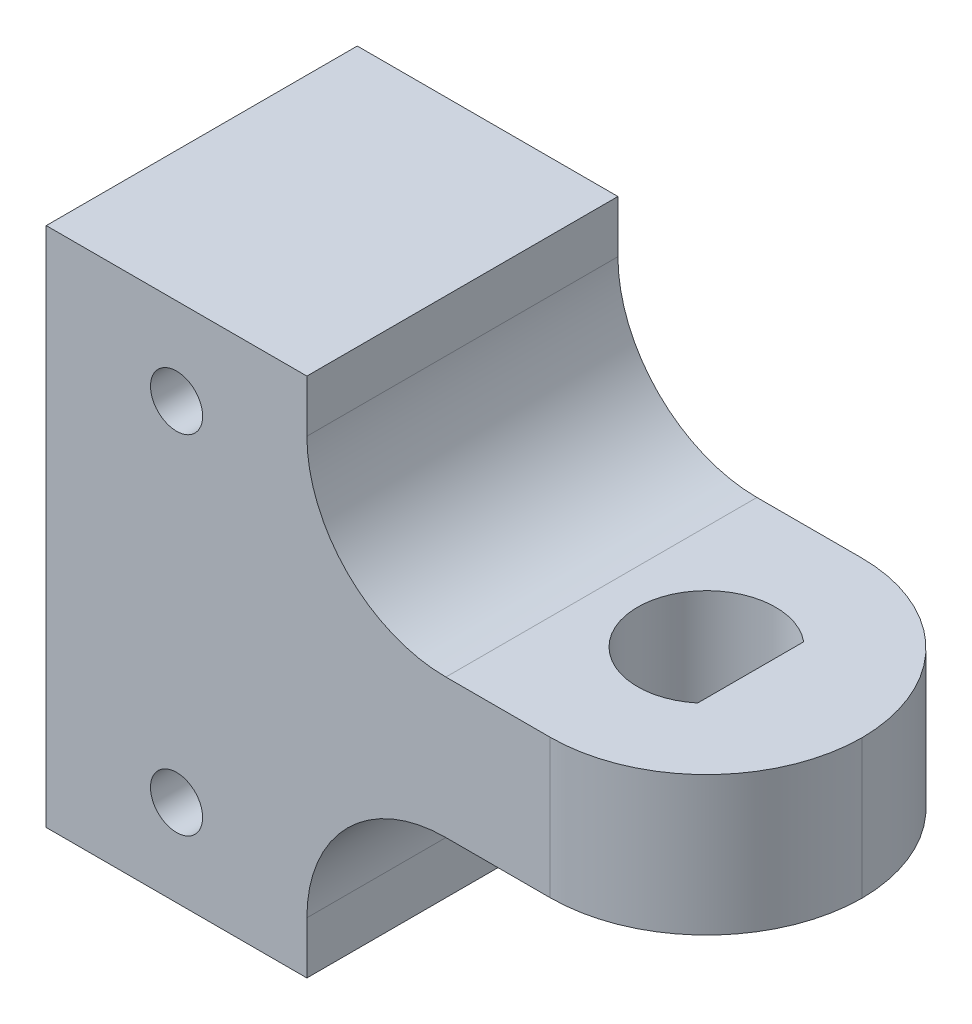
ISO-10303-21;
HEADER;
FILE_DESCRIPTION(('STEP AP214'),'2;1');
FILE_NAME('part.step','',(''),(''),'','','');
FILE_SCHEMA(('AUTOMOTIVE_DESIGN { 1 0 10303 214 1 1 1 1 }'));
ENDSEC;
DATA;
#1=APPLICATION_CONTEXT('core data for automotive mechanical design processes');
#2=APPLICATION_PROTOCOL_DEFINITION('international standard','automotive_design',2000,#1);
#3=PRODUCT_CONTEXT('',#1,'mechanical');
#4=PRODUCT('Part','Part','',(#3));
#5=PRODUCT_RELATED_PRODUCT_CATEGORY('part','',(#4));
#6=PRODUCT_DEFINITION_FORMATION('','',#4);
#7=PRODUCT_DEFINITION_CONTEXT('part definition',#1,'design');
#8=PRODUCT_DEFINITION('design','',#6,#7);
#9=PRODUCT_DEFINITION_SHAPE('','',#8);
#10=(LENGTH_UNIT() NAMED_UNIT(*) SI_UNIT(.MILLI.,.METRE.));
#11=(NAMED_UNIT(*) PLANE_ANGLE_UNIT() SI_UNIT($,.RADIAN.));
#12=(NAMED_UNIT(*) SI_UNIT($,.STERADIAN.) SOLID_ANGLE_UNIT());
#13=UNCERTAINTY_MEASURE_WITH_UNIT(LENGTH_MEASURE(1.E-05),#10,'distance_accuracy_value','');
#14=(GEOMETRIC_REPRESENTATION_CONTEXT(3) GLOBAL_UNCERTAINTY_ASSIGNED_CONTEXT((#13)) GLOBAL_UNIT_ASSIGNED_CONTEXT((#10,
#11,#12)) REPRESENTATION_CONTEXT('',''));
#15=CARTESIAN_POINT('',(0.,0.,0.));
#16=DIRECTION('',(0.,0.,1.));
#17=DIRECTION('',(1.,0.,0.));
#18=AXIS2_PLACEMENT_3D('',#15,#16,#17);
#19=CARTESIAN_POINT('',(7.5,-4.,17.9));
#20=DIRECTION('',(-1.,0.,0.));
#21=DIRECTION('',(0.,-1.,0.));
#22=AXIS2_PLACEMENT_3D('',#19,#20,#21);
#23=PLANE('',#22);
#24=DIRECTION('',(0.,1.,0.));
#25=VECTOR('',#24,1.);
#26=CARTESIAN_POINT('',(7.5,-4.,0.));
#27=LINE('',#26,#25);
#28=CARTESIAN_POINT('',(7.5,-15.,0.));
#29=VERTEX_POINT('',#28);
#30=CARTESIAN_POINT('',(7.5,-12.,0.));
#31=VERTEX_POINT('',#30);
#32=EDGE_CURVE('E178',#29,#31,#27,.T.);
#33=ORIENTED_EDGE('',*,*,#32,.T.);
#34=DIRECTION('',(0.,0.,-1.));
#35=VECTOR('',#34,1.);
#36=CARTESIAN_POINT('',(7.5,-12.,17.9));
#37=LINE('',#36,#35);
#38=CARTESIAN_POINT('',(7.5,-12.,17.9));
#39=VERTEX_POINT('',#38);
#40=EDGE_CURVE('E222',#31,#39,#37,.F.);
#41=ORIENTED_EDGE('',*,*,#40,.T.);
#42=DIRECTION('',(0.,1.,0.));
#43=VECTOR('',#42,1.);
#44=CARTESIAN_POINT('',(7.5,-4.,17.9));
#45=LINE('',#44,#43);
#46=CARTESIAN_POINT('',(7.5,-15.,17.9));
#47=VERTEX_POINT('',#46);
#48=EDGE_CURVE('E161',#47,#39,#45,.T.);
#49=ORIENTED_EDGE('',*,*,#48,.F.);
#50=DIRECTION('',(0.,0.,-1.));
#51=VECTOR('',#50,1.);
#52=CARTESIAN_POINT('',(7.5,-15.,17.9));
#53=LINE('',#52,#51);
#54=EDGE_CURVE('E177',#47,#29,#53,.T.);
#55=ORIENTED_EDGE('',*,*,#54,.T.);
#56=EDGE_LOOP('',(#33,#41,#49,#55));
#57=FACE_BOUND('',#56,.T.);
#58=ADVANCED_FACE('F33',(#57),#23,.F.);
#59=CARTESIAN_POINT('',(30.5,-4.,17.9));
#60=DIRECTION('',(0.,1.,0.));
#61=DIRECTION('',(0.,0.,1.));
#62=AXIS2_PLACEMENT_3D('',#59,#60,#61);
#63=PLANE('',#62);
#64=DIRECTION('',(0.,0.,1.));
#65=VECTOR('',#64,1.);
#66=CARTESIAN_POINT('',(24.04,-4.,5.8488854495447));
#67=LINE('',#66,#65);
#68=CARTESIAN_POINT('',(24.04,-4.,5.8488854495447));
#69=VERTEX_POINT('',#68);
#70=CARTESIAN_POINT('',(24.04,-4.,11.9511145504553));
#71=VERTEX_POINT('',#70);
#72=EDGE_CURVE('E142',#69,#71,#67,.T.);
#73=ORIENTED_EDGE('',*,*,#72,.F.);
#74=CARTESIAN_POINT('',(21.5,-4.,8.9));
#75=DIRECTION('',(0.,1.,0.));
#76=DIRECTION('',(0.,0.,1.));
#77=AXIS2_PLACEMENT_3D('',#74,#75,#76);
#78=CIRCLE('',#77,3.97);
#79=EDGE_CURVE('E131',#71,#69,#78,.F.);
#80=ORIENTED_EDGE('',*,*,#79,.F.);
#81=EDGE_LOOP('',(#73,#80));
#82=FACE_BOUND('',#81,.T.);
#83=DIRECTION('',(1.,0.,0.));
#84=VECTOR('',#83,1.);
#85=CARTESIAN_POINT('',(30.5,-4.,17.9));
#86=LINE('',#85,#84);
#87=CARTESIAN_POINT('',(15.5,-4.,17.9));
#88=VERTEX_POINT('',#87);
#89=CARTESIAN_POINT('',(21.5,-4.,17.9));
#90=VERTEX_POINT('',#89);
#91=EDGE_CURVE('E164',#88,#90,#86,.T.);
#92=ORIENTED_EDGE('',*,*,#91,.F.);
#93=DIRECTION('',(0.,0.,-1.));
#94=VECTOR('',#93,1.);
#95=CARTESIAN_POINT('',(15.5,-4.,0.));
#96=LINE('',#95,#94);
#97=CARTESIAN_POINT('',(15.5,-4.,0.));
#98=VERTEX_POINT('',#97);
#99=EDGE_CURVE('E217',#88,#98,#96,.T.);
#100=ORIENTED_EDGE('',*,*,#99,.T.);
#101=DIRECTION('',(1.,0.,0.));
#102=VECTOR('',#101,1.);
#103=CARTESIAN_POINT('',(30.5,-4.,0.));
#104=LINE('',#103,#102);
#105=CARTESIAN_POINT('',(21.5,-4.,0.));
#106=VERTEX_POINT('',#105);
#107=EDGE_CURVE('E181',#98,#106,#104,.T.);
#108=ORIENTED_EDGE('',*,*,#107,.T.);
#109=CARTESIAN_POINT('',(21.5,-4.,9.));
#110=DIRECTION('',(0.,1.,0.));
#111=DIRECTION('',(0.,0.,1.));
#112=AXIS2_PLACEMENT_3D('',#109,#110,#111);
#113=CIRCLE('',#112,9.);
#114=CARTESIAN_POINT('',(30.4998611100394,-4.,8.95));
#115=VERTEX_POINT('',#114);
#116=EDGE_CURVE('E213',#106,#115,#113,.F.);
#117=ORIENTED_EDGE('',*,*,#116,.T.);
#118=CARTESIAN_POINT('',(21.5,-4.,8.9));
#119=DIRECTION('',(0.,1.,0.));
#120=DIRECTION('',(0.,0.,1.));
#121=AXIS2_PLACEMENT_3D('',#118,#119,#120);
#122=CIRCLE('',#121,9.);
#123=EDGE_CURVE('E210',#115,#90,#122,.F.);
#124=ORIENTED_EDGE('',*,*,#123,.T.);
#125=EDGE_LOOP('',(#92,#100,#108,#117,#124));
#126=FACE_BOUND('',#125,.T.);
#127=ADVANCED_FACE('F147',(#82,#126),#63,.F.);
#128=CARTESIAN_POINT('',(7.5,4.,17.9));
#129=DIRECTION('',(0.,-1.,0.));
#130=DIRECTION('',(0.,0.,-1.));
#131=AXIS2_PLACEMENT_3D('',#128,#129,#130);
#132=PLANE('',#131);
#133=DIRECTION('',(0.,0.,-1.));
#134=VECTOR('',#133,1.);
#135=CARTESIAN_POINT('',(24.04,4.,5.8488854495447));
#136=LINE('',#135,#134);
#137=CARTESIAN_POINT('',(24.04,4.,11.9511145504553));
#138=VERTEX_POINT('',#137);
#139=CARTESIAN_POINT('',(24.04,4.,5.8488854495447));
#140=VERTEX_POINT('',#139);
#141=EDGE_CURVE('E139',#138,#140,#136,.T.);
#142=ORIENTED_EDGE('',*,*,#141,.F.);
#143=CARTESIAN_POINT('',(21.5,4.,8.9));
#144=DIRECTION('',(0.,1.,0.));
#145=DIRECTION('',(0.,0.,1.));
#146=AXIS2_PLACEMENT_3D('',#143,#144,#145);
#147=CIRCLE('',#146,3.97);
#148=EDGE_CURVE('E134',#140,#138,#147,.T.);
#149=ORIENTED_EDGE('',*,*,#148,.F.);
#150=EDGE_LOOP('',(#142,#149));
#151=FACE_BOUND('',#150,.T.);
#152=DIRECTION('',(-1.,0.,0.));
#153=VECTOR('',#152,1.);
#154=CARTESIAN_POINT('',(7.5,4.,0.));
#155=LINE('',#154,#153);
#156=CARTESIAN_POINT('',(21.5,4.,0.));
#157=VERTEX_POINT('',#156);
#158=CARTESIAN_POINT('',(15.5,4.,0.));
#159=VERTEX_POINT('',#158);
#160=EDGE_CURVE('E183',#157,#159,#155,.T.);
#161=ORIENTED_EDGE('',*,*,#160,.T.);
#162=DIRECTION('',(0.,0.,-1.));
#163=VECTOR('',#162,1.);
#164=CARTESIAN_POINT('',(15.5,4.00000000000001,17.9));
#165=LINE('',#164,#163);
#166=CARTESIAN_POINT('',(15.5,4.,17.9));
#167=VERTEX_POINT('',#166);
#168=EDGE_CURVE('E48',#159,#167,#165,.F.);
#169=ORIENTED_EDGE('',*,*,#168,.T.);
#170=DIRECTION('',(-1.,0.,0.));
#171=VECTOR('',#170,1.);
#172=CARTESIAN_POINT('',(7.5,4.,17.9));
#173=LINE('',#172,#171);
#174=CARTESIAN_POINT('',(21.5,4.,17.9));
#175=VERTEX_POINT('',#174);
#176=EDGE_CURVE('E167',#175,#167,#173,.T.);
#177=ORIENTED_EDGE('',*,*,#176,.F.);
#178=CARTESIAN_POINT('',(21.5,4.,8.9));
#179=DIRECTION('',(0.,-1.,0.));
#180=DIRECTION('',(0.,0.,-1.));
#181=AXIS2_PLACEMENT_3D('',#178,#179,#180);
#182=CIRCLE('',#181,9.);
#183=CARTESIAN_POINT('',(30.4998611100394,4.,8.95));
#184=VERTEX_POINT('',#183);
#185=EDGE_CURVE('E203',#175,#184,#182,.F.);
#186=ORIENTED_EDGE('',*,*,#185,.T.);
#187=CARTESIAN_POINT('',(21.5,4.,9.));
#188=DIRECTION('',(0.,-1.,0.));
#189=DIRECTION('',(0.,0.,-1.));
#190=AXIS2_PLACEMENT_3D('',#187,#188,#189);
#191=CIRCLE('',#190,9.);
#192=EDGE_CURVE('E205',#184,#157,#191,.F.);
#193=ORIENTED_EDGE('',*,*,#192,.T.);
#194=EDGE_LOOP('',(#161,#169,#177,#186,#193));
#195=FACE_BOUND('',#194,.T.);
#196=ADVANCED_FACE('F269',(#151,#195),#132,.F.);
#197=CARTESIAN_POINT('',(7.5,15.,17.9));
#198=DIRECTION('',(-1.,0.,0.));
#199=DIRECTION('',(0.,-1.,0.));
#200=AXIS2_PLACEMENT_3D('',#197,#198,#199);
#201=PLANE('',#200);
#202=DIRECTION('',(0.,1.,0.));
#203=VECTOR('',#202,1.);
#204=CARTESIAN_POINT('',(7.5,15.,17.9));
#205=LINE('',#204,#203);
#206=CARTESIAN_POINT('',(7.5,12.,17.9));
#207=VERTEX_POINT('',#206);
#208=CARTESIAN_POINT('',(7.5,15.,17.9));
#209=VERTEX_POINT('',#208);
#210=EDGE_CURVE('E169',#207,#209,#205,.T.);
#211=ORIENTED_EDGE('',*,*,#210,.F.);
#212=DIRECTION('',(0.,0.,-1.));
#213=VECTOR('',#212,1.);
#214=CARTESIAN_POINT('',(7.5,12.,0.));
#215=LINE('',#214,#213);
#216=CARTESIAN_POINT('',(7.5,12.,0.));
#217=VERTEX_POINT('',#216);
#218=EDGE_CURVE('E224',#207,#217,#215,.T.);
#219=ORIENTED_EDGE('',*,*,#218,.T.);
#220=DIRECTION('',(0.,1.,0.));
#221=VECTOR('',#220,1.);
#222=CARTESIAN_POINT('',(7.5,15.,0.));
#223=LINE('',#222,#221);
#224=CARTESIAN_POINT('',(7.5,15.,0.));
#225=VERTEX_POINT('',#224);
#226=EDGE_CURVE('E185',#217,#225,#223,.T.);
#227=ORIENTED_EDGE('',*,*,#226,.T.);
#228=DIRECTION('',(0.,0.,-1.));
#229=VECTOR('',#228,1.);
#230=CARTESIAN_POINT('',(7.5,15.,17.9));
#231=LINE('',#230,#229);
#232=EDGE_CURVE('E200',#209,#225,#231,.T.);
#233=ORIENTED_EDGE('',*,*,#232,.F.);
#234=EDGE_LOOP('',(#211,#219,#227,#233));
#235=FACE_BOUND('',#234,.T.);
#236=ADVANCED_FACE('F264',(#235),#201,.F.);
#237=CARTESIAN_POINT('',(-7.5,15.,17.9));
#238=DIRECTION('',(0.,-1.,0.));
#239=DIRECTION('',(0.,0.,-1.));
#240=AXIS2_PLACEMENT_3D('',#237,#238,#239);
#241=PLANE('',#240);
#242=DIRECTION('',(-1.,0.,0.));
#243=VECTOR('',#242,1.);
#244=CARTESIAN_POINT('',(-7.5,15.,0.));
#245=LINE('',#244,#243);
#246=CARTESIAN_POINT('',(-7.5,15.,0.));
#247=VERTEX_POINT('',#246);
#248=EDGE_CURVE('E187',#225,#247,#245,.T.);
#249=ORIENTED_EDGE('',*,*,#248,.T.);
#250=DIRECTION('',(0.,0.,-1.));
#251=VECTOR('',#250,1.);
#252=CARTESIAN_POINT('',(-7.5,15.,17.9));
#253=LINE('',#252,#251);
#254=CARTESIAN_POINT('',(-7.5,15.,17.9));
#255=VERTEX_POINT('',#254);
#256=EDGE_CURVE('E197',#255,#247,#253,.T.);
#257=ORIENTED_EDGE('',*,*,#256,.F.);
#258=DIRECTION('',(-1.,0.,0.));
#259=VECTOR('',#258,1.);
#260=CARTESIAN_POINT('',(-7.5,15.,17.9));
#261=LINE('',#260,#259);
#262=EDGE_CURVE('E171',#209,#255,#261,.T.);
#263=ORIENTED_EDGE('',*,*,#262,.F.);
#264=ORIENTED_EDGE('',*,*,#232,.T.);
#265=EDGE_LOOP('',(#249,#257,#263,#264));
#266=FACE_BOUND('',#265,.T.);
#267=ADVANCED_FACE('F260',(#266),#241,.F.);
#268=CARTESIAN_POINT('',(-7.5,15.,17.9));
#269=DIRECTION('',(1.,0.,0.));
#270=DIRECTION('',(0.,0.,-1.));
#271=AXIS2_PLACEMENT_3D('',#268,#269,#270);
#272=PLANE('',#271);
#273=DIRECTION('',(0.,-1.,0.));
#274=VECTOR('',#273,1.);
#275=CARTESIAN_POINT('',(-7.5,15.,0.));
#276=LINE('',#275,#274);
#277=CARTESIAN_POINT('',(-7.5,-15.,0.));
#278=VERTEX_POINT('',#277);
#279=EDGE_CURVE('E189',#247,#278,#276,.T.);
#280=ORIENTED_EDGE('',*,*,#279,.T.);
#281=DIRECTION('',(0.,0.,-1.));
#282=VECTOR('',#281,1.);
#283=CARTESIAN_POINT('',(-7.5,-15.,17.9));
#284=LINE('',#283,#282);
#285=CARTESIAN_POINT('',(-7.5,-15.,17.9));
#286=VERTEX_POINT('',#285);
#287=EDGE_CURVE('E194',#286,#278,#284,.T.);
#288=ORIENTED_EDGE('',*,*,#287,.F.);
#289=DIRECTION('',(0.,-1.,0.));
#290=VECTOR('',#289,1.);
#291=CARTESIAN_POINT('',(-7.5,15.,17.9));
#292=LINE('',#291,#290);
#293=EDGE_CURVE('E173',#255,#286,#292,.T.);
#294=ORIENTED_EDGE('',*,*,#293,.F.);
#295=ORIENTED_EDGE('',*,*,#256,.T.);
#296=EDGE_LOOP('',(#280,#288,#294,#295));
#297=FACE_BOUND('',#296,.T.);
#298=ADVANCED_FACE('F255',(#297),#272,.F.);
#299=CARTESIAN_POINT('',(-7.5,-15.,17.9));
#300=DIRECTION('',(0.,1.,0.));
#301=DIRECTION('',(-1.,0.,0.));
#302=AXIS2_PLACEMENT_3D('',#299,#300,#301);
#303=PLANE('',#302);
#304=DIRECTION('',(1.,0.,0.));
#305=VECTOR('',#304,1.);
#306=CARTESIAN_POINT('',(-7.5,-15.,0.));
#307=LINE('',#306,#305);
#308=EDGE_CURVE('E165',#278,#29,#307,.T.);
#309=ORIENTED_EDGE('',*,*,#308,.T.);
#310=ORIENTED_EDGE('',*,*,#54,.F.);
#311=DIRECTION('',(1.,0.,0.));
#312=VECTOR('',#311,1.);
#313=CARTESIAN_POINT('',(-7.5,-15.,17.9));
#314=LINE('',#313,#312);
#315=EDGE_CURVE('E175',#286,#47,#314,.T.);
#316=ORIENTED_EDGE('',*,*,#315,.F.);
#317=ORIENTED_EDGE('',*,*,#287,.T.);
#318=EDGE_LOOP('',(#309,#310,#316,#317));
#319=FACE_BOUND('',#318,.T.);
#320=ADVANCED_FACE('F250',(#319),#303,.F.);
#321=CARTESIAN_POINT('',(0.,0.,17.9));
#322=DIRECTION('',(0.,0.,1.));
#323=DIRECTION('',(1.,0.,0.));
#324=AXIS2_PLACEMENT_3D('',#321,#322,#323);
#325=PLANE('',#324);
#326=CARTESIAN_POINT('',(0.,10.,17.9));
#327=DIRECTION('',(0.,0.,1.));
#328=DIRECTION('',(1.,0.,0.));
#329=AXIS2_PLACEMENT_3D('',#326,#327,#328);
#330=CIRCLE('',#329,1.5);
#331=CARTESIAN_POINT('',(1.5,10.,17.9));
#332=VERTEX_POINT('',#331);
#333=EDGE_CURVE('E153',#332,#332,#330,.T.);
#334=ORIENTED_EDGE('',*,*,#333,.F.);
#335=EDGE_LOOP('',(#334));
#336=FACE_BOUND('',#335,.T.);
#337=CARTESIAN_POINT('',(0.,-10.,17.9));
#338=DIRECTION('',(0.,0.,1.));
#339=DIRECTION('',(-1.,0.,0.));
#340=AXIS2_PLACEMENT_3D('',#337,#338,#339);
#341=CIRCLE('',#340,1.5);
#342=CARTESIAN_POINT('',(-1.5,-10.,17.9));
#343=VERTEX_POINT('',#342);
#344=EDGE_CURVE('E330',#343,#343,#341,.T.);
#345=ORIENTED_EDGE('',*,*,#344,.F.);
#346=EDGE_LOOP('',(#345));
#347=FACE_BOUND('',#346,.T.);
#348=ORIENTED_EDGE('',*,*,#48,.T.);
#349=CARTESIAN_POINT('',(15.5,-12.,17.9));
#350=DIRECTION('',(0.,0.,1.));
#351=DIRECTION('',(1.,0.,0.));
#352=AXIS2_PLACEMENT_3D('',#349,#350,#351);
#353=CIRCLE('',#352,8.);
#354=EDGE_CURVE('E230',#39,#88,#353,.F.);
#355=ORIENTED_EDGE('',*,*,#354,.T.);
#356=ORIENTED_EDGE('',*,*,#91,.T.);
#357=DIRECTION('',(0.,1.,0.));
#358=VECTOR('',#357,1.);
#359=CARTESIAN_POINT('',(21.5,4.,17.9));
#360=LINE('',#359,#358);
#361=EDGE_CURVE('E215',#90,#175,#360,.T.);
#362=ORIENTED_EDGE('',*,*,#361,.T.);
#363=ORIENTED_EDGE('',*,*,#176,.T.);
#364=CARTESIAN_POINT('',(15.5,12.,17.9));
#365=DIRECTION('',(0.,0.,1.));
#366=DIRECTION('',(1.,0.,0.));
#367=AXIS2_PLACEMENT_3D('',#364,#365,#366);
#368=CIRCLE('',#367,8.);
#369=EDGE_CURVE('E11',#167,#207,#368,.F.);
#370=ORIENTED_EDGE('',*,*,#369,.T.);
#371=ORIENTED_EDGE('',*,*,#210,.T.);
#372=ORIENTED_EDGE('',*,*,#262,.T.);
#373=ORIENTED_EDGE('',*,*,#293,.T.);
#374=ORIENTED_EDGE('',*,*,#315,.T.);
#375=EDGE_LOOP('',(#348,#355,#356,#362,#363,#370,#371,#372,#373,#374));
#376=FACE_BOUND('',#375,.T.);
#377=ADVANCED_FACE('F234',(#336,#347,#376),#325,.T.);
#378=CARTESIAN_POINT('',(0.,0.,0.));
#379=DIRECTION('',(0.,0.,1.));
#380=DIRECTION('',(1.,0.,0.));
#381=AXIS2_PLACEMENT_3D('',#378,#379,#380);
#382=PLANE('',#381);
#383=CARTESIAN_POINT('',(0.,10.,0.));
#384=DIRECTION('',(0.,0.,1.));
#385=DIRECTION('',(1.,0.,0.));
#386=AXIS2_PLACEMENT_3D('',#383,#384,#385);
#387=CIRCLE('',#386,1.5);
#388=CARTESIAN_POINT('',(1.5,10.,0.));
#389=VERTEX_POINT('',#388);
#390=EDGE_CURVE('E149',#389,#389,#387,.F.);
#391=ORIENTED_EDGE('',*,*,#390,.F.);
#392=EDGE_LOOP('',(#391));
#393=FACE_BOUND('',#392,.T.);
#394=CARTESIAN_POINT('',(0.,-10.,0.));
#395=DIRECTION('',(0.,0.,1.));
#396=DIRECTION('',(1.,0.,0.));
#397=AXIS2_PLACEMENT_3D('',#394,#395,#396);
#398=CIRCLE('',#397,1.5);
#399=CARTESIAN_POINT('',(1.5,-10.,0.));
#400=VERTEX_POINT('',#399);
#401=EDGE_CURVE('E156',#400,#400,#398,.F.);
#402=ORIENTED_EDGE('',*,*,#401,.F.);
#403=EDGE_LOOP('',(#402));
#404=FACE_BOUND('',#403,.T.);
#405=ORIENTED_EDGE('',*,*,#160,.F.);
#406=DIRECTION('',(0.,1.,0.));
#407=VECTOR('',#406,1.);
#408=CARTESIAN_POINT('',(21.5,0.,0.));
#409=LINE('',#408,#407);
#410=EDGE_CURVE('E207',#157,#106,#409,.F.);
#411=ORIENTED_EDGE('',*,*,#410,.T.);
#412=ORIENTED_EDGE('',*,*,#107,.F.);
#413=CARTESIAN_POINT('',(15.5,-12.,0.));
#414=DIRECTION('',(0.,0.,1.));
#415=DIRECTION('',(1.,0.,0.));
#416=AXIS2_PLACEMENT_3D('',#413,#414,#415);
#417=CIRCLE('',#416,8.);
#418=EDGE_CURVE('E228',#98,#31,#417,.T.);
#419=ORIENTED_EDGE('',*,*,#418,.T.);
#420=ORIENTED_EDGE('',*,*,#32,.F.);
#421=ORIENTED_EDGE('',*,*,#308,.F.);
#422=ORIENTED_EDGE('',*,*,#279,.F.);
#423=ORIENTED_EDGE('',*,*,#248,.F.);
#424=ORIENTED_EDGE('',*,*,#226,.F.);
#425=CARTESIAN_POINT('',(15.5,12.,0.));
#426=DIRECTION('',(0.,0.,1.));
#427=DIRECTION('',(1.,0.,0.));
#428=AXIS2_PLACEMENT_3D('',#425,#426,#427);
#429=CIRCLE('',#428,8.);
#430=EDGE_CURVE('E41',#217,#159,#429,.T.);
#431=ORIENTED_EDGE('',*,*,#430,.T.);
#432=EDGE_LOOP('',(#405,#411,#412,#419,#420,#421,#422,#423,#424,#431));
#433=FACE_BOUND('',#432,.T.);
#434=ADVANCED_FACE('F244',(#393,#404,#433),#382,.F.);
#435=CARTESIAN_POINT('',(21.5,0.,8.9));
#436=DIRECTION('',(0.,-1.,0.));
#437=DIRECTION('',(0.,0.,-1.));
#438=AXIS2_PLACEMENT_3D('',#435,#436,#437);
#439=CYLINDRICAL_SURFACE('',#438,9.);
#440=ORIENTED_EDGE('',*,*,#361,.F.);
#441=ORIENTED_EDGE('',*,*,#123,.F.);
#442=DIRECTION('',(0.,-1.,0.));
#443=VECTOR('',#442,1.);
#444=CARTESIAN_POINT('',(30.4998611100394,0.,8.95));
#445=LINE('',#444,#443);
#446=EDGE_CURVE('E145',#184,#115,#445,.T.);
#447=ORIENTED_EDGE('',*,*,#446,.F.);
#448=ORIENTED_EDGE('',*,*,#185,.F.);
#449=EDGE_LOOP('',(#440,#441,#447,#448));
#450=FACE_BOUND('',#449,.T.);
#451=ADVANCED_FACE('F272',(#450),#439,.T.);
#452=CARTESIAN_POINT('',(21.5,4.,9.));
#453=DIRECTION('',(0.,1.,0.));
#454=DIRECTION('',(0.,0.,1.));
#455=AXIS2_PLACEMENT_3D('',#452,#453,#454);
#456=CYLINDRICAL_SURFACE('',#455,9.);
#457=ORIENTED_EDGE('',*,*,#116,.F.);
#458=ORIENTED_EDGE('',*,*,#410,.F.);
#459=ORIENTED_EDGE('',*,*,#192,.F.);
#460=ORIENTED_EDGE('',*,*,#446,.T.);
#461=EDGE_LOOP('',(#457,#458,#459,#460));
#462=FACE_BOUND('',#461,.T.);
#463=ADVANCED_FACE('F277',(#462),#456,.T.);
#464=CARTESIAN_POINT('',(21.5,-15.001,8.9));
#465=DIRECTION('',(0.,1.,0.));
#466=DIRECTION('',(0.,0.,1.));
#467=AXIS2_PLACEMENT_3D('',#464,#465,#466);
#468=CYLINDRICAL_SURFACE('',#467,3.97);
#469=ORIENTED_EDGE('',*,*,#79,.T.);
#470=DIRECTION('',(0.,1.,0.));
#471=VECTOR('',#470,1.);
#472=CARTESIAN_POINT('',(24.04,-15.001,5.8488854495447));
#473=LINE('',#472,#471);
#474=EDGE_CURVE('E138',#69,#140,#473,.T.);
#475=ORIENTED_EDGE('',*,*,#474,.T.);
#476=ORIENTED_EDGE('',*,*,#148,.T.);
#477=DIRECTION('',(0.,1.,0.));
#478=VECTOR('',#477,1.);
#479=CARTESIAN_POINT('',(24.04,-15.001,11.9511145504553));
#480=LINE('',#479,#478);
#481=EDGE_CURVE('E127',#71,#138,#480,.T.);
#482=ORIENTED_EDGE('',*,*,#481,.F.);
#483=EDGE_LOOP('',(#469,#475,#476,#482));
#484=FACE_BOUND('',#483,.T.);
#485=ADVANCED_FACE('F129',(#484),#468,.F.);
#486=CARTESIAN_POINT('',(24.04,-15.001,5.8488854495447));
#487=DIRECTION('',(1.,0.,0.));
#488=DIRECTION('',(0.,0.,-1.));
#489=AXIS2_PLACEMENT_3D('',#486,#487,#488);
#490=PLANE('',#489);
#491=ORIENTED_EDGE('',*,*,#72,.T.);
#492=ORIENTED_EDGE('',*,*,#481,.T.);
#493=ORIENTED_EDGE('',*,*,#141,.T.);
#494=ORIENTED_EDGE('',*,*,#474,.F.);
#495=EDGE_LOOP('',(#491,#492,#493,#494));
#496=FACE_BOUND('',#495,.T.);
#497=ADVANCED_FACE('F143',(#496),#490,.F.);
#498=CARTESIAN_POINT('',(0.,-10.,-0.001000000000001));
#499=DIRECTION('',(0.,0.,1.));
#500=DIRECTION('',(1.,0.,0.));
#501=AXIS2_PLACEMENT_3D('',#498,#499,#500);
#502=CYLINDRICAL_SURFACE('',#501,1.5);
#503=ORIENTED_EDGE('',*,*,#344,.T.);
#504=EDGE_LOOP('',(#503));
#505=FACE_BOUND('',#504,.T.);
#506=ORIENTED_EDGE('',*,*,#401,.T.);
#507=EDGE_LOOP('',(#506));
#508=FACE_BOUND('',#507,.T.);
#509=ADVANCED_FACE('F312',(#505,#508),#502,.F.);
#510=CARTESIAN_POINT('',(0.,10.,-0.001000000000001));
#511=DIRECTION('',(0.,0.,1.));
#512=DIRECTION('',(1.,0.,0.));
#513=AXIS2_PLACEMENT_3D('',#510,#511,#512);
#514=CYLINDRICAL_SURFACE('',#513,1.5);
#515=ORIENTED_EDGE('',*,*,#333,.T.);
#516=EDGE_LOOP('',(#515));
#517=FACE_BOUND('',#516,.T.);
#518=ORIENTED_EDGE('',*,*,#390,.T.);
#519=EDGE_LOOP('',(#518));
#520=FACE_BOUND('',#519,.T.);
#521=ADVANCED_FACE('F315',(#517,#520),#514,.F.);
#522=CARTESIAN_POINT('',(15.5,-12.,17.9));
#523=DIRECTION('',(0.,0.,1.));
#524=DIRECTION('',(1.,0.,0.));
#525=AXIS2_PLACEMENT_3D('',#522,#523,#524);
#526=CYLINDRICAL_SURFACE('',#525,8.);
#527=ORIENTED_EDGE('',*,*,#354,.F.);
#528=ORIENTED_EDGE('',*,*,#40,.F.);
#529=ORIENTED_EDGE('',*,*,#418,.F.);
#530=ORIENTED_EDGE('',*,*,#99,.F.);
#531=EDGE_LOOP('',(#527,#528,#529,#530));
#532=FACE_BOUND('',#531,.T.);
#533=ADVANCED_FACE('F242',(#532),#526,.F.);
#534=CARTESIAN_POINT('',(15.5,12.,17.9));
#535=DIRECTION('',(0.,0.,1.));
#536=DIRECTION('',(1.,0.,0.));
#537=AXIS2_PLACEMENT_3D('',#534,#535,#536);
#538=CYLINDRICAL_SURFACE('',#537,8.);
#539=ORIENTED_EDGE('',*,*,#369,.F.);
#540=ORIENTED_EDGE('',*,*,#168,.F.);
#541=ORIENTED_EDGE('',*,*,#430,.F.);
#542=ORIENTED_EDGE('',*,*,#218,.F.);
#543=EDGE_LOOP('',(#539,#540,#541,#542));
#544=FACE_BOUND('',#543,.T.);
#545=ADVANCED_FACE('F35',(#544),#538,.F.);
#546=CLOSED_SHELL('',(#58,#127,#196,#236,#267,#298,#320,#377,#434,#451,#463,#485,#497,#509,#521,
#533,#545));
#547=MANIFOLD_SOLID_BREP('B2',#546);
#548=ADVANCED_BREP_SHAPE_REPRESENTATION('',(#18,#547),#14);
#549=SHAPE_DEFINITION_REPRESENTATION(#9,#548);
ENDSEC;
END-ISO-10303-21;
